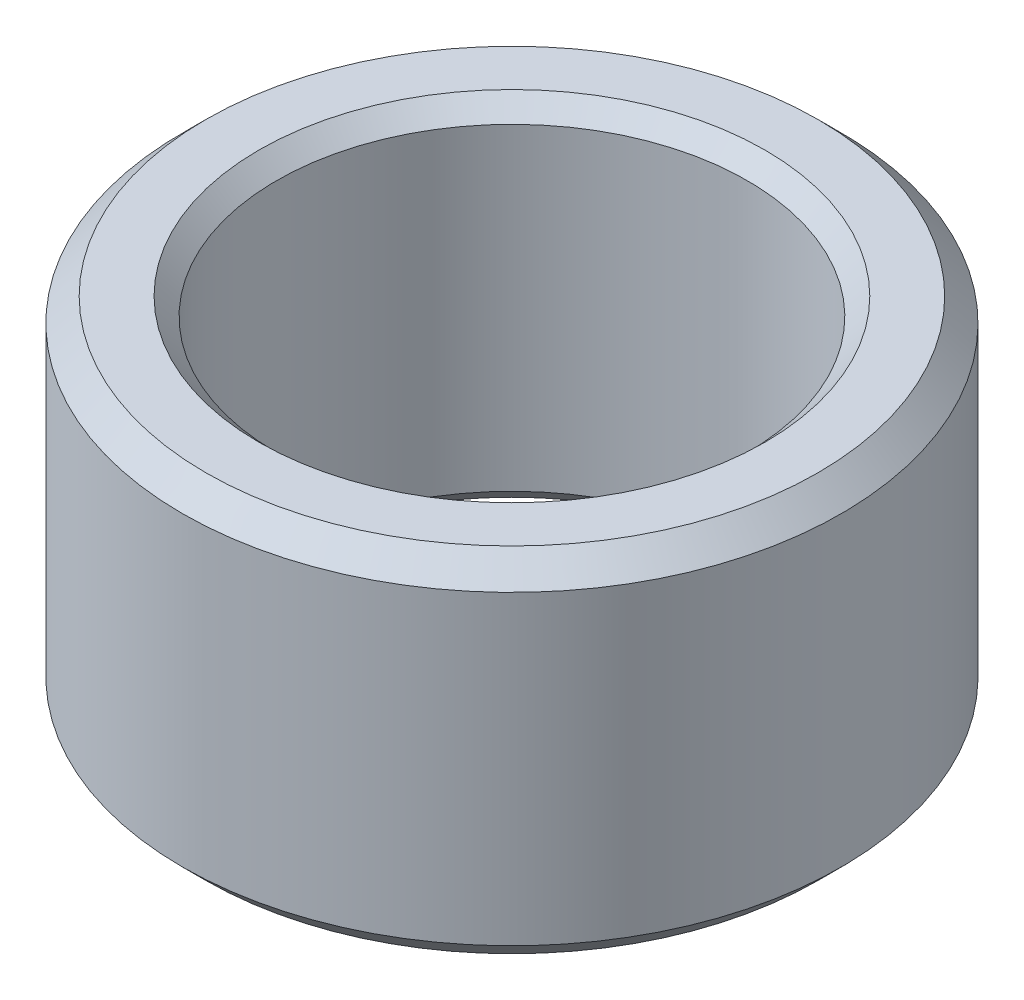
ISO-10303-21;
HEADER;
FILE_DESCRIPTION(('STEP AP214'),'2;1');
FILE_NAME('part.step','',(''),(''),'','','');
FILE_SCHEMA(('AUTOMOTIVE_DESIGN { 1 0 10303 214 1 1 1 1 }'));
ENDSEC;
DATA;
#1=APPLICATION_CONTEXT('core data for automotive mechanical design processes');
#2=APPLICATION_PROTOCOL_DEFINITION('international standard','automotive_design',2000,#1);
#3=PRODUCT_CONTEXT('',#1,'mechanical');
#4=PRODUCT('Part','Part','',(#3));
#5=PRODUCT_RELATED_PRODUCT_CATEGORY('part','',(#4));
#6=PRODUCT_DEFINITION_FORMATION('','',#4);
#7=PRODUCT_DEFINITION_CONTEXT('part definition',#1,'design');
#8=PRODUCT_DEFINITION('design','',#6,#7);
#9=PRODUCT_DEFINITION_SHAPE('','',#8);
#10=(LENGTH_UNIT() NAMED_UNIT(*) SI_UNIT(.MILLI.,.METRE.));
#11=(NAMED_UNIT(*) PLANE_ANGLE_UNIT() SI_UNIT($,.RADIAN.));
#12=(NAMED_UNIT(*) SI_UNIT($,.STERADIAN.) SOLID_ANGLE_UNIT());
#13=UNCERTAINTY_MEASURE_WITH_UNIT(LENGTH_MEASURE(1.E-05),#10,'distance_accuracy_value','');
#14=(GEOMETRIC_REPRESENTATION_CONTEXT(3) GLOBAL_UNCERTAINTY_ASSIGNED_CONTEXT((#13)) GLOBAL_UNIT_ASSIGNED_CONTEXT((#10,
#11,#12)) REPRESENTATION_CONTEXT('',''));
#15=CARTESIAN_POINT('',(0.,0.,0.));
#16=DIRECTION('',(0.,0.,1.));
#17=DIRECTION('',(1.,0.,0.));
#18=AXIS2_PLACEMENT_3D('',#15,#16,#17);
#19=CARTESIAN_POINT('',(0.,6.,0.));
#20=DIRECTION('',(0.,1.,0.));
#21=DIRECTION('',(0.,0.,1.));
#22=AXIS2_PLACEMENT_3D('',#19,#20,#21);
#23=PLANE('',#22);
#24=CARTESIAN_POINT('',(0.,6.,0.));
#25=DIRECTION('',(0.,1.,0.));
#26=DIRECTION('',(0.,0.,1.));
#27=AXIS2_PLACEMENT_3D('',#24,#25,#26);
#28=CIRCLE('',#27,5.2);
#29=CARTESIAN_POINT('',(0.,6.,5.2));
#30=VERTEX_POINT('',#29);
#31=EDGE_CURVE('E50',#30,#30,#28,.T.);
#32=ORIENTED_EDGE('',*,*,#31,.T.);
#33=EDGE_LOOP('',(#32));
#34=FACE_BOUND('',#33,.T.);
#35=CARTESIAN_POINT('',(0.,6.,0.));
#36=DIRECTION('',(0.,1.,0.));
#37=DIRECTION('',(0.,0.,1.));
#38=AXIS2_PLACEMENT_3D('',#35,#36,#37);
#39=CIRCLE('',#38,4.3);
#40=CARTESIAN_POINT('',(0.,6.,4.3));
#41=VERTEX_POINT('',#40);
#42=EDGE_CURVE('E55',#41,#41,#39,.F.);
#43=ORIENTED_EDGE('',*,*,#42,.T.);
#44=EDGE_LOOP('',(#43));
#45=FACE_BOUND('',#44,.T.);
#46=ADVANCED_FACE('F35',(#34,#45),#23,.T.);
#47=CARTESIAN_POINT('',(0.,0.,0.));
#48=DIRECTION('',(0.,1.,0.));
#49=DIRECTION('',(0.,0.,1.));
#50=AXIS2_PLACEMENT_3D('',#47,#48,#49);
#51=PLANE('',#50);
#52=CARTESIAN_POINT('',(0.,0.,0.));
#53=DIRECTION('',(0.,1.,0.));
#54=DIRECTION('',(0.,0.,1.));
#55=AXIS2_PLACEMENT_3D('',#52,#53,#54);
#56=CIRCLE('',#55,5.2);
#57=CARTESIAN_POINT('',(0.,0.,5.2));
#58=VERTEX_POINT('',#57);
#59=EDGE_CURVE('E10',#58,#58,#56,.F.);
#60=ORIENTED_EDGE('',*,*,#59,.T.);
#61=EDGE_LOOP('',(#60));
#62=FACE_BOUND('',#61,.T.);
#63=CARTESIAN_POINT('',(0.,0.,0.));
#64=DIRECTION('',(0.,1.,0.));
#65=DIRECTION('',(0.,0.,1.));
#66=AXIS2_PLACEMENT_3D('',#63,#64,#65);
#67=CIRCLE('',#66,4.3);
#68=CARTESIAN_POINT('',(0.,0.,4.3));
#69=VERTEX_POINT('',#68);
#70=EDGE_CURVE('E64',#69,#69,#67,.T.);
#71=ORIENTED_EDGE('',*,*,#70,.T.);
#72=EDGE_LOOP('',(#71));
#73=FACE_BOUND('',#72,.T.);
#74=ADVANCED_FACE('F68',(#62,#73),#51,.F.);
#75=CARTESIAN_POINT('',(0.,6.,0.));
#76=DIRECTION('',(0.,-1.,0.));
#77=DIRECTION('',(0.,0.,-1.));
#78=AXIS2_PLACEMENT_3D('',#75,#76,#77);
#79=CYLINDRICAL_SURFACE('',#78,5.6);
#80=CARTESIAN_POINT('',(0.,5.6,0.));
#81=DIRECTION('',(0.,1.,0.));
#82=DIRECTION('',(0.,0.,1.));
#83=AXIS2_PLACEMENT_3D('',#80,#81,#82);
#84=CIRCLE('',#83,5.6);
#85=CARTESIAN_POINT('',(0.,5.6,5.6));
#86=VERTEX_POINT('',#85);
#87=EDGE_CURVE('E42',#86,#86,#84,.F.);
#88=ORIENTED_EDGE('',*,*,#87,.T.);
#89=EDGE_LOOP('',(#88));
#90=FACE_BOUND('',#89,.T.);
#91=CARTESIAN_POINT('',(0.,0.400000000000002,0.));
#92=DIRECTION('',(0.,1.,0.));
#93=DIRECTION('',(0.,0.,1.));
#94=AXIS2_PLACEMENT_3D('',#91,#92,#93);
#95=CIRCLE('',#94,5.6);
#96=CARTESIAN_POINT('',(0.,0.400000000000002,5.6));
#97=VERTEX_POINT('',#96);
#98=EDGE_CURVE('E46',#97,#97,#95,.T.);
#99=ORIENTED_EDGE('',*,*,#98,.T.);
#100=EDGE_LOOP('',(#99));
#101=FACE_BOUND('',#100,.T.);
#102=ADVANCED_FACE('F83',(#90,#101),#79,.T.);
#103=CARTESIAN_POINT('',(0.,6.,0.));
#104=DIRECTION('',(0.,-1.,0.));
#105=DIRECTION('',(0.,0.,-1.));
#106=AXIS2_PLACEMENT_3D('',#103,#104,#105);
#107=CYLINDRICAL_SURFACE('',#106,4.);
#108=CARTESIAN_POINT('',(0.,0.299999999999998,0.));
#109=DIRECTION('',(0.,1.,0.));
#110=DIRECTION('',(0.,0.,1.));
#111=AXIS2_PLACEMENT_3D('',#108,#109,#110);
#112=CIRCLE('',#111,4.);
#113=CARTESIAN_POINT('',(0.,0.299999999999998,4.));
#114=VERTEX_POINT('',#113);
#115=EDGE_CURVE('E58',#114,#114,#112,.F.);
#116=ORIENTED_EDGE('',*,*,#115,.T.);
#117=EDGE_LOOP('',(#116));
#118=FACE_BOUND('',#117,.T.);
#119=CARTESIAN_POINT('',(0.,5.7,0.));
#120=DIRECTION('',(0.,1.,0.));
#121=DIRECTION('',(0.,0.,1.));
#122=AXIS2_PLACEMENT_3D('',#119,#120,#121);
#123=CIRCLE('',#122,4.);
#124=CARTESIAN_POINT('',(0.,5.7,4.));
#125=VERTEX_POINT('',#124);
#126=EDGE_CURVE('E61',#125,#125,#123,.T.);
#127=ORIENTED_EDGE('',*,*,#126,.T.);
#128=EDGE_LOOP('',(#127));
#129=FACE_BOUND('',#128,.T.);
#130=ADVANCED_FACE('F73',(#118,#129),#107,.F.);
#131=CARTESIAN_POINT('',(0.,0.,0.));
#132=DIRECTION('',(0.,-1.,0.));
#133=DIRECTION('',(0.,0.,-1.));
#134=AXIS2_PLACEMENT_3D('',#131,#132,#133);
#135=CONICAL_SURFACE('',#134,4.3,0.785398163397448);
#136=ORIENTED_EDGE('',*,*,#115,.F.);
#137=EDGE_LOOP('',(#136));
#138=FACE_BOUND('',#137,.T.);
#139=ORIENTED_EDGE('',*,*,#70,.F.);
#140=EDGE_LOOP('',(#139));
#141=FACE_BOUND('',#140,.T.);
#142=ADVANCED_FACE('F70',(#138,#141),#135,.F.);
#143=CARTESIAN_POINT('',(0.,5.7,0.));
#144=DIRECTION('',(0.,1.,0.));
#145=DIRECTION('',(0.,0.,1.));
#146=AXIS2_PLACEMENT_3D('',#143,#144,#145);
#147=CONICAL_SURFACE('',#146,4.,0.785398163397445);
#148=ORIENTED_EDGE('',*,*,#42,.F.);
#149=EDGE_LOOP('',(#148));
#150=FACE_BOUND('',#149,.T.);
#151=ORIENTED_EDGE('',*,*,#126,.F.);
#152=EDGE_LOOP('',(#151));
#153=FACE_BOUND('',#152,.T.);
#154=ADVANCED_FACE('F72',(#150,#153),#147,.F.);
#155=CARTESIAN_POINT('',(0.,6.,0.));
#156=DIRECTION('',(0.,-1.,0.));
#157=DIRECTION('',(0.,0.,-1.));
#158=AXIS2_PLACEMENT_3D('',#155,#156,#157);
#159=CONICAL_SURFACE('',#158,5.2,0.785398163397447);
#160=ORIENTED_EDGE('',*,*,#87,.F.);
#161=EDGE_LOOP('',(#160));
#162=FACE_BOUND('',#161,.T.);
#163=ORIENTED_EDGE('',*,*,#31,.F.);
#164=EDGE_LOOP('',(#163));
#165=FACE_BOUND('',#164,.T.);
#166=ADVANCED_FACE('F80',(#162,#165),#159,.T.);
#167=CARTESIAN_POINT('',(0.,0.400000000000002,0.));
#168=DIRECTION('',(0.,1.,0.));
#169=DIRECTION('',(0.,0.,1.));
#170=AXIS2_PLACEMENT_3D('',#167,#168,#169);
#171=CONICAL_SURFACE('',#170,5.6,0.78539816339745);
#172=ORIENTED_EDGE('',*,*,#59,.F.);
#173=EDGE_LOOP('',(#172));
#174=FACE_BOUND('',#173,.T.);
#175=ORIENTED_EDGE('',*,*,#98,.F.);
#176=EDGE_LOOP('',(#175));
#177=FACE_BOUND('',#176,.T.);
#178=ADVANCED_FACE('F37',(#174,#177),#171,.T.);
#179=CLOSED_SHELL('',(#46,#74,#102,#130,#142,#154,#166,#178));
#180=MANIFOLD_SOLID_BREP('B2',#179);
#181=ADVANCED_BREP_SHAPE_REPRESENTATION('',(#18,#180),#14);
#182=SHAPE_DEFINITION_REPRESENTATION(#9,#181);
ENDSEC;
END-ISO-10303-21;
